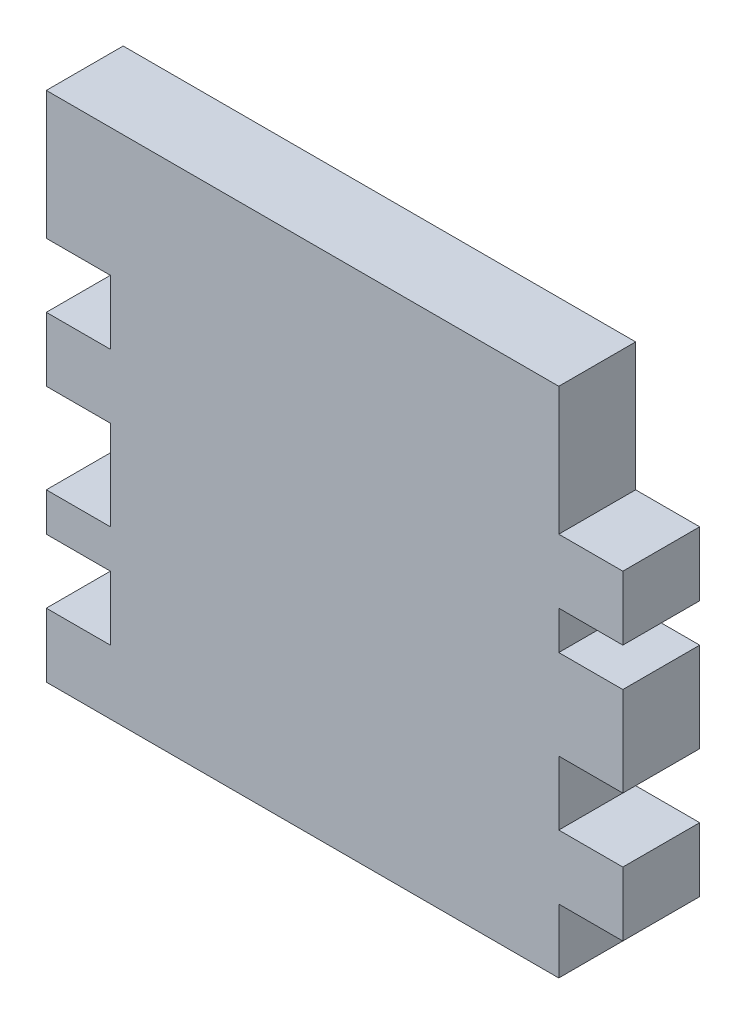
ISO-10303-21;
HEADER;
FILE_DESCRIPTION(('STEP AP214'),'2;1');
FILE_NAME('part.step','',(''),(''),'','','');
FILE_SCHEMA(('AUTOMOTIVE_DESIGN { 1 0 10303 214 1 1 1 1 }'));
ENDSEC;
DATA;
#1=APPLICATION_CONTEXT('core data for automotive mechanical design processes');
#2=APPLICATION_PROTOCOL_DEFINITION('international standard','automotive_design',2000,#1);
#3=PRODUCT_CONTEXT('',#1,'mechanical');
#4=PRODUCT('Part','Part','',(#3));
#5=PRODUCT_RELATED_PRODUCT_CATEGORY('part','',(#4));
#6=PRODUCT_DEFINITION_FORMATION('','',#4);
#7=PRODUCT_DEFINITION_CONTEXT('part definition',#1,'design');
#8=PRODUCT_DEFINITION('design','',#6,#7);
#9=PRODUCT_DEFINITION_SHAPE('','',#8);
#10=(LENGTH_UNIT() NAMED_UNIT(*) SI_UNIT(.MILLI.,.METRE.));
#11=(NAMED_UNIT(*) PLANE_ANGLE_UNIT() SI_UNIT($,.RADIAN.));
#12=(NAMED_UNIT(*) SI_UNIT($,.STERADIAN.) SOLID_ANGLE_UNIT());
#13=UNCERTAINTY_MEASURE_WITH_UNIT(LENGTH_MEASURE(1.E-05),#10,'distance_accuracy_value','');
#14=(GEOMETRIC_REPRESENTATION_CONTEXT(3) GLOBAL_UNCERTAINTY_ASSIGNED_CONTEXT((#13)) GLOBAL_UNIT_ASSIGNED_CONTEXT((#10,
#11,#12)) REPRESENTATION_CONTEXT('',''));
#15=CARTESIAN_POINT('',(0.,0.,0.));
#16=DIRECTION('',(0.,0.,1.));
#17=DIRECTION('',(1.,0.,0.));
#18=AXIS2_PLACEMENT_3D('',#15,#16,#17);
#19=CARTESIAN_POINT('',(0.,0.,6.));
#20=DIRECTION('',(0.,0.,-1.));
#21=DIRECTION('',(-1.,0.,0.));
#22=AXIS2_PLACEMENT_3D('',#19,#20,#21);
#23=PLANE('',#22);
#24=DIRECTION('',(0.,1.,0.));
#25=VECTOR('',#24,1.);
#26=CARTESIAN_POINT('',(21.566265060241,0.,6.));
#27=LINE('',#26,#25);
#28=CARTESIAN_POINT('',(21.566265060241,7.48493975903614,6.));
#29=VERTEX_POINT('',#28);
#30=CARTESIAN_POINT('',(21.566265060241,17.4849397590361,6.));
#31=VERTEX_POINT('',#30);
#32=EDGE_CURVE('E232',#29,#31,#27,.T.);
#33=ORIENTED_EDGE('',*,*,#32,.T.);
#34=DIRECTION('',(1.,0.,0.));
#35=VECTOR('',#34,1.);
#36=CARTESIAN_POINT('',(-18.433734939759,17.4849397590361,6.));
#37=LINE('',#36,#35);
#38=CARTESIAN_POINT('',(-18.433734939759,17.4849397590361,6.));
#39=VERTEX_POINT('',#38);
#40=EDGE_CURVE('E475',#39,#31,#37,.T.);
#41=ORIENTED_EDGE('',*,*,#40,.F.);
#42=DIRECTION('',(0.,-1.,0.));
#43=VECTOR('',#42,1.);
#44=CARTESIAN_POINT('',(-18.433734939759,17.4849397590361,6.));
#45=LINE('',#44,#43);
#46=CARTESIAN_POINT('',(-18.433734939759,7.48493975903614,6.));
#47=VERTEX_POINT('',#46);
#48=EDGE_CURVE('E480',#39,#47,#45,.T.);
#49=ORIENTED_EDGE('',*,*,#48,.T.);
#50=DIRECTION('',(1.,0.,0.));
#51=VECTOR('',#50,1.);
#52=CARTESIAN_POINT('',(-18.433734939759,7.48493975903614,6.));
#53=LINE('',#52,#51);
#54=CARTESIAN_POINT('',(-13.433734939759,7.48493975903614,6.));
#55=VERTEX_POINT('',#54);
#56=EDGE_CURVE('E361',#47,#55,#53,.T.);
#57=ORIENTED_EDGE('',*,*,#56,.T.);
#58=DIRECTION('',(0.,-1.,0.));
#59=VECTOR('',#58,1.);
#60=CARTESIAN_POINT('',(-13.433734939759,7.48493975903614,6.));
#61=LINE('',#60,#59);
#62=CARTESIAN_POINT('',(-13.433734939759,2.48493975903614,6.));
#63=VERTEX_POINT('',#62);
#64=EDGE_CURVE('E373',#55,#63,#61,.T.);
#65=ORIENTED_EDGE('',*,*,#64,.T.);
#66=DIRECTION('',(1.,0.,0.));
#67=VECTOR('',#66,1.);
#68=CARTESIAN_POINT('',(-18.433734939759,2.48493975903614,6.));
#69=LINE('',#68,#67);
#70=CARTESIAN_POINT('',(-18.433734939759,2.48493975903614,6.));
#71=VERTEX_POINT('',#70);
#72=EDGE_CURVE('E369',#71,#63,#69,.T.);
#73=ORIENTED_EDGE('',*,*,#72,.F.);
#74=CARTESIAN_POINT('',(-18.433734939759,-2.51506024096386,6.));
#75=VERTEX_POINT('',#74);
#76=EDGE_CURVE('E484',#71,#75,#45,.T.);
#77=ORIENTED_EDGE('',*,*,#76,.T.);
#78=DIRECTION('',(1.,0.,0.));
#79=VECTOR('',#78,1.);
#80=CARTESIAN_POINT('',(-18.433734939759,-2.51506024096386,6.));
#81=LINE('',#80,#79);
#82=CARTESIAN_POINT('',(-13.433734939759,-2.51506024096386,6.));
#83=VERTEX_POINT('',#82);
#84=EDGE_CURVE('E409',#75,#83,#81,.T.);
#85=ORIENTED_EDGE('',*,*,#84,.T.);
#86=DIRECTION('',(0.,-1.,0.));
#87=VECTOR('',#86,1.);
#88=CARTESIAN_POINT('',(-13.433734939759,-2.51506024096386,6.));
#89=LINE('',#88,#87);
#90=CARTESIAN_POINT('',(-13.433734939759,-9.51506024096386,6.));
#91=VERTEX_POINT('',#90);
#92=EDGE_CURVE('E413',#83,#91,#89,.T.);
#93=ORIENTED_EDGE('',*,*,#92,.T.);
#94=DIRECTION('',(1.,0.,0.));
#95=VECTOR('',#94,1.);
#96=CARTESIAN_POINT('',(-18.433734939759,-9.51506024096386,6.));
#97=LINE('',#96,#95);
#98=CARTESIAN_POINT('',(-18.433734939759,-9.51506024096386,6.));
#99=VERTEX_POINT('',#98);
#100=EDGE_CURVE('E374',#99,#91,#97,.T.);
#101=ORIENTED_EDGE('',*,*,#100,.F.);
#102=CARTESIAN_POINT('',(-18.433734939759,-12.5150602409639,6.));
#103=VERTEX_POINT('',#102);
#104=EDGE_CURVE('E518',#99,#103,#45,.T.);
#105=ORIENTED_EDGE('',*,*,#104,.T.);
#106=DIRECTION('',(1.,0.,0.));
#107=VECTOR('',#106,1.);
#108=CARTESIAN_POINT('',(-18.433734939759,-12.5150602409639,6.));
#109=LINE('',#108,#107);
#110=CARTESIAN_POINT('',(-13.433734939759,-12.5150602409639,6.));
#111=VERTEX_POINT('',#110);
#112=EDGE_CURVE('E443',#103,#111,#109,.T.);
#113=ORIENTED_EDGE('',*,*,#112,.T.);
#114=DIRECTION('',(0.,-1.,0.));
#115=VECTOR('',#114,1.);
#116=CARTESIAN_POINT('',(-13.433734939759,-12.5150602409639,6.));
#117=LINE('',#116,#115);
#118=CARTESIAN_POINT('',(-13.433734939759,-17.5150602409639,6.));
#119=VERTEX_POINT('',#118);
#120=EDGE_CURVE('E447',#111,#119,#117,.T.);
#121=ORIENTED_EDGE('',*,*,#120,.T.);
#122=DIRECTION('',(1.,0.,0.));
#123=VECTOR('',#122,1.);
#124=CARTESIAN_POINT('',(-18.433734939759,-17.5150602409639,6.));
#125=LINE('',#124,#123);
#126=CARTESIAN_POINT('',(-18.433734939759,-17.5150602409639,6.));
#127=VERTEX_POINT('',#126);
#128=EDGE_CURVE('E408',#127,#119,#125,.T.);
#129=ORIENTED_EDGE('',*,*,#128,.F.);
#130=CARTESIAN_POINT('',(-18.433734939759,-22.5150602409639,6.));
#131=VERTEX_POINT('',#130);
#132=EDGE_CURVE('E479',#127,#131,#45,.T.);
#133=ORIENTED_EDGE('',*,*,#132,.T.);
#134=DIRECTION('',(1.,0.,0.));
#135=VECTOR('',#134,1.);
#136=CARTESIAN_POINT('',(-18.433734939759,-22.5150602409639,6.));
#137=LINE('',#136,#135);
#138=CARTESIAN_POINT('',(21.566265060241,-22.5150602409639,6.));
#139=VERTEX_POINT('',#138);
#140=EDGE_CURVE('E464',#131,#139,#137,.T.);
#141=ORIENTED_EDGE('',*,*,#140,.T.);
#142=DIRECTION('',(0.,-1.,0.));
#143=VECTOR('',#142,1.);
#144=CARTESIAN_POINT('',(21.566265060241,0.,6.));
#145=LINE('',#144,#143);
#146=CARTESIAN_POINT('',(21.566265060241,-17.5150602409639,6.));
#147=VERTEX_POINT('',#146);
#148=EDGE_CURVE('E337',#147,#139,#145,.T.);
#149=ORIENTED_EDGE('',*,*,#148,.F.);
#150=DIRECTION('',(-1.,0.,0.));
#151=VECTOR('',#150,1.);
#152=CARTESIAN_POINT('',(0.,-17.5150602409638,6.));
#153=LINE('',#152,#151);
#154=CARTESIAN_POINT('',(26.566265060241,-17.5150602409639,6.));
#155=VERTEX_POINT('',#154);
#156=EDGE_CURVE('E342',#155,#147,#153,.T.);
#157=ORIENTED_EDGE('',*,*,#156,.F.);
#158=DIRECTION('',(0.,-1.,0.));
#159=VECTOR('',#158,1.);
#160=CARTESIAN_POINT('',(26.566265060241,17.4849397590361,6.));
#161=LINE('',#160,#159);
#162=CARTESIAN_POINT('',(26.566265060241,-12.5150602409639,6.));
#163=VERTEX_POINT('',#162);
#164=EDGE_CURVE('E468',#163,#155,#161,.T.);
#165=ORIENTED_EDGE('',*,*,#164,.F.);
#166=DIRECTION('',(-1.,0.,0.));
#167=VECTOR('',#166,1.);
#168=CARTESIAN_POINT('',(0.,-12.5150602409639,6.));
#169=LINE('',#168,#167);
#170=CARTESIAN_POINT('',(21.566265060241,-12.5150602409639,6.));
#171=VERTEX_POINT('',#170);
#172=EDGE_CURVE('E65',#163,#171,#169,.T.);
#173=ORIENTED_EDGE('',*,*,#172,.T.);
#174=DIRECTION('',(0.,1.,0.));
#175=VECTOR('',#174,1.);
#176=CARTESIAN_POINT('',(21.566265060241,0.,6.));
#177=LINE('',#176,#175);
#178=CARTESIAN_POINT('',(21.566265060241,-7.51506024096386,6.));
#179=VERTEX_POINT('',#178);
#180=EDGE_CURVE('E314',#171,#179,#177,.T.);
#181=ORIENTED_EDGE('',*,*,#180,.T.);
#182=DIRECTION('',(-1.,0.,0.));
#183=VECTOR('',#182,1.);
#184=CARTESIAN_POINT('',(0.,-7.51506024096386,6.));
#185=LINE('',#184,#183);
#186=CARTESIAN_POINT('',(26.566265060241,-7.51506024096386,6.));
#187=VERTEX_POINT('',#186);
#188=EDGE_CURVE('E306',#187,#179,#185,.T.);
#189=ORIENTED_EDGE('',*,*,#188,.F.);
#190=CARTESIAN_POINT('',(26.566265060241,-0.515060240963858,6.));
#191=VERTEX_POINT('',#190);
#192=EDGE_CURVE('E473',#191,#187,#161,.T.);
#193=ORIENTED_EDGE('',*,*,#192,.F.);
#194=DIRECTION('',(-1.,0.,0.));
#195=VECTOR('',#194,1.);
#196=CARTESIAN_POINT('',(0.,-0.51506024096386,6.));
#197=LINE('',#196,#195);
#198=CARTESIAN_POINT('',(21.566265060241,-0.515060240963858,6.));
#199=VERTEX_POINT('',#198);
#200=EDGE_CURVE('E282',#191,#199,#197,.T.);
#201=ORIENTED_EDGE('',*,*,#200,.T.);
#202=DIRECTION('',(0.,1.,0.));
#203=VECTOR('',#202,1.);
#204=CARTESIAN_POINT('',(21.566265060241,0.,6.));
#205=LINE('',#204,#203);
#206=CARTESIAN_POINT('',(21.566265060241,2.48493975903614,6.));
#207=VERTEX_POINT('',#206);
#208=EDGE_CURVE('E278',#199,#207,#205,.T.);
#209=ORIENTED_EDGE('',*,*,#208,.T.);
#210=DIRECTION('',(1.,0.,0.));
#211=VECTOR('',#210,1.);
#212=CARTESIAN_POINT('',(0.,2.48493975903614,6.));
#213=LINE('',#212,#211);
#214=CARTESIAN_POINT('',(26.566265060241,2.48493975903614,6.));
#215=VERTEX_POINT('',#214);
#216=EDGE_CURVE('E271',#207,#215,#213,.T.);
#217=ORIENTED_EDGE('',*,*,#216,.T.);
#218=CARTESIAN_POINT('',(26.566265060241,7.48493975903614,6.));
#219=VERTEX_POINT('',#218);
#220=EDGE_CURVE('E474',#219,#215,#161,.T.);
#221=ORIENTED_EDGE('',*,*,#220,.F.);
#222=DIRECTION('',(1.,0.,0.));
#223=VECTOR('',#222,1.);
#224=CARTESIAN_POINT('',(0.,7.48493975903614,6.));
#225=LINE('',#224,#223);
#226=EDGE_CURVE('E253',#29,#219,#225,.T.);
#227=ORIENTED_EDGE('',*,*,#226,.F.);
#228=EDGE_LOOP('',(#33,#41,#49,#57,#65,#73,#77,#85,#93,#101,#105,#113,#121,#129,#133,#141,#149,
#157,#165,#173,#181,#189,#193,#201,#209,#217,#221,#227));
#229=FACE_BOUND('',#228,.T.);
#230=ADVANCED_FACE('F41',(#229),#23,.F.);
#231=CARTESIAN_POINT('',(0.,0.,0.));
#232=DIRECTION('',(0.,0.,-1.));
#233=DIRECTION('',(-1.,0.,0.));
#234=AXIS2_PLACEMENT_3D('',#231,#232,#233);
#235=PLANE('',#234);
#236=DIRECTION('',(1.,0.,0.));
#237=VECTOR('',#236,1.);
#238=CARTESIAN_POINT('',(-18.433734939759,17.4849397590361,0.));
#239=LINE('',#238,#237);
#240=CARTESIAN_POINT('',(-18.433734939759,17.4849397590361,0.));
#241=VERTEX_POINT('',#240);
#242=CARTESIAN_POINT('',(21.5662650602409,17.4849397590361,0.));
#243=VERTEX_POINT('',#242);
#244=EDGE_CURVE('E251',#241,#243,#239,.T.);
#245=ORIENTED_EDGE('',*,*,#244,.T.);
#246=DIRECTION('',(0.,1.,0.));
#247=VECTOR('',#246,1.);
#248=CARTESIAN_POINT('',(21.566265060241,0.,0.));
#249=LINE('',#248,#247);
#250=CARTESIAN_POINT('',(21.566265060241,7.48493975903614,0.));
#251=VERTEX_POINT('',#250);
#252=EDGE_CURVE('E229',#251,#243,#249,.T.);
#253=ORIENTED_EDGE('',*,*,#252,.F.);
#254=DIRECTION('',(1.,0.,0.));
#255=VECTOR('',#254,1.);
#256=CARTESIAN_POINT('',(0.,7.48493975903614,0.));
#257=LINE('',#256,#255);
#258=CARTESIAN_POINT('',(26.566265060241,7.48493975903614,0.));
#259=VERTEX_POINT('',#258);
#260=EDGE_CURVE('E237',#251,#259,#257,.T.);
#261=ORIENTED_EDGE('',*,*,#260,.T.);
#262=DIRECTION('',(0.,-1.,0.));
#263=VECTOR('',#262,1.);
#264=CARTESIAN_POINT('',(26.566265060241,17.4849397590361,0.));
#265=LINE('',#264,#263);
#266=CARTESIAN_POINT('',(26.566265060241,2.48493975903614,0.));
#267=VERTEX_POINT('',#266);
#268=EDGE_CURVE('E493',#259,#267,#265,.T.);
#269=ORIENTED_EDGE('',*,*,#268,.T.);
#270=DIRECTION('',(1.,0.,0.));
#271=VECTOR('',#270,1.);
#272=CARTESIAN_POINT('',(0.,2.48493975903614,0.));
#273=LINE('',#272,#271);
#274=CARTESIAN_POINT('',(21.566265060241,2.48493975903614,0.));
#275=VERTEX_POINT('',#274);
#276=EDGE_CURVE('E274',#275,#267,#273,.T.);
#277=ORIENTED_EDGE('',*,*,#276,.F.);
#278=DIRECTION('',(0.,1.,0.));
#279=VECTOR('',#278,1.);
#280=CARTESIAN_POINT('',(21.566265060241,0.,0.));
#281=LINE('',#280,#279);
#282=CARTESIAN_POINT('',(21.566265060241,-0.515060240963858,0.));
#283=VERTEX_POINT('',#282);
#284=EDGE_CURVE('E267',#283,#275,#281,.T.);
#285=ORIENTED_EDGE('',*,*,#284,.F.);
#286=DIRECTION('',(-1.,0.,0.));
#287=VECTOR('',#286,1.);
#288=CARTESIAN_POINT('',(0.,-0.51506024096386,0.));
#289=LINE('',#288,#287);
#290=CARTESIAN_POINT('',(26.566265060241,-0.515060240963858,0.));
#291=VERTEX_POINT('',#290);
#292=EDGE_CURVE('E270',#291,#283,#289,.T.);
#293=ORIENTED_EDGE('',*,*,#292,.F.);
#294=CARTESIAN_POINT('',(26.566265060241,-7.51506024096386,0.));
#295=VERTEX_POINT('',#294);
#296=EDGE_CURVE('E492',#291,#295,#265,.T.);
#297=ORIENTED_EDGE('',*,*,#296,.T.);
#298=DIRECTION('',(-1.,0.,0.));
#299=VECTOR('',#298,1.);
#300=CARTESIAN_POINT('',(0.,-7.51506024096386,0.));
#301=LINE('',#300,#299);
#302=CARTESIAN_POINT('',(21.566265060241,-7.51506024096386,0.));
#303=VERTEX_POINT('',#302);
#304=EDGE_CURVE('E309',#295,#303,#301,.T.);
#305=ORIENTED_EDGE('',*,*,#304,.T.);
#306=DIRECTION('',(0.,1.,0.));
#307=VECTOR('',#306,1.);
#308=CARTESIAN_POINT('',(21.566265060241,0.,0.));
#309=LINE('',#308,#307);
#310=CARTESIAN_POINT('',(21.566265060241,-12.5150602409639,0.));
#311=VERTEX_POINT('',#310);
#312=EDGE_CURVE('E302',#311,#303,#309,.T.);
#313=ORIENTED_EDGE('',*,*,#312,.F.);
#314=DIRECTION('',(-1.,0.,0.));
#315=VECTOR('',#314,1.);
#316=CARTESIAN_POINT('',(0.,-12.5150602409639,0.));
#317=LINE('',#316,#315);
#318=CARTESIAN_POINT('',(26.566265060241,-12.5150602409639,0.));
#319=VERTEX_POINT('',#318);
#320=EDGE_CURVE('E305',#319,#311,#317,.T.);
#321=ORIENTED_EDGE('',*,*,#320,.F.);
#322=CARTESIAN_POINT('',(26.566265060241,-17.5150602409639,0.));
#323=VERTEX_POINT('',#322);
#324=EDGE_CURVE('E488',#319,#323,#265,.T.);
#325=ORIENTED_EDGE('',*,*,#324,.T.);
#326=DIRECTION('',(-1.,0.,0.));
#327=VECTOR('',#326,1.);
#328=CARTESIAN_POINT('',(0.,-17.5150602409638,0.));
#329=LINE('',#328,#327);
#330=CARTESIAN_POINT('',(21.566265060241,-17.5150602409639,0.));
#331=VERTEX_POINT('',#330);
#332=EDGE_CURVE('E57',#323,#331,#329,.T.);
#333=ORIENTED_EDGE('',*,*,#332,.T.);
#334=DIRECTION('',(0.,-1.,0.));
#335=VECTOR('',#334,1.);
#336=CARTESIAN_POINT('',(21.566265060241,0.,0.));
#337=LINE('',#336,#335);
#338=CARTESIAN_POINT('',(21.566265060241,-22.5150602409639,0.));
#339=VERTEX_POINT('',#338);
#340=EDGE_CURVE('E336',#331,#339,#337,.T.);
#341=ORIENTED_EDGE('',*,*,#340,.T.);
#342=DIRECTION('',(1.,0.,0.));
#343=VECTOR('',#342,1.);
#344=CARTESIAN_POINT('',(-18.433734939759,-22.5150602409639,0.));
#345=LINE('',#344,#343);
#346=CARTESIAN_POINT('',(-18.433734939759,-22.5150602409639,0.));
#347=VERTEX_POINT('',#346);
#348=EDGE_CURVE('E384',#347,#339,#345,.T.);
#349=ORIENTED_EDGE('',*,*,#348,.F.);
#350=DIRECTION('',(0.,-1.,0.));
#351=VECTOR('',#350,1.);
#352=CARTESIAN_POINT('',(-18.433734939759,17.4849397590361,0.));
#353=LINE('',#352,#351);
#354=CARTESIAN_POINT('',(-18.433734939759,-17.5150602409639,0.));
#355=VERTEX_POINT('',#354);
#356=EDGE_CURVE('E496',#355,#347,#353,.T.);
#357=ORIENTED_EDGE('',*,*,#356,.F.);
#358=DIRECTION('',(1.,0.,0.));
#359=VECTOR('',#358,1.);
#360=CARTESIAN_POINT('',(-18.433734939759,-17.5150602409639,0.));
#361=LINE('',#360,#359);
#362=CARTESIAN_POINT('',(-13.433734939759,-17.5150602409639,0.));
#363=VERTEX_POINT('',#362);
#364=EDGE_CURVE('E448',#355,#363,#361,.T.);
#365=ORIENTED_EDGE('',*,*,#364,.T.);
#366=DIRECTION('',(0.,-1.,0.));
#367=VECTOR('',#366,1.);
#368=CARTESIAN_POINT('',(-13.433734939759,-12.5150602409639,0.));
#369=LINE('',#368,#367);
#370=CARTESIAN_POINT('',(-13.433734939759,-12.5150602409639,0.));
#371=VERTEX_POINT('',#370);
#372=EDGE_CURVE('E458',#371,#363,#369,.T.);
#373=ORIENTED_EDGE('',*,*,#372,.F.);
#374=DIRECTION('',(1.,0.,0.));
#375=VECTOR('',#374,1.);
#376=CARTESIAN_POINT('',(-18.433734939759,-12.5150602409639,0.));
#377=LINE('',#376,#375);
#378=CARTESIAN_POINT('',(-18.433734939759,-12.5150602409639,0.));
#379=VERTEX_POINT('',#378);
#380=EDGE_CURVE('E433',#379,#371,#377,.T.);
#381=ORIENTED_EDGE('',*,*,#380,.F.);
#382=CARTESIAN_POINT('',(-18.433734939759,-9.51506024096386,0.));
#383=VERTEX_POINT('',#382);
#384=EDGE_CURVE('E547',#383,#379,#353,.T.);
#385=ORIENTED_EDGE('',*,*,#384,.F.);
#386=DIRECTION('',(1.,0.,0.));
#387=VECTOR('',#386,1.);
#388=CARTESIAN_POINT('',(-18.433734939759,-9.51506024096386,0.));
#389=LINE('',#388,#387);
#390=CARTESIAN_POINT('',(-13.433734939759,-9.51506024096386,0.));
#391=VERTEX_POINT('',#390);
#392=EDGE_CURVE('E414',#383,#391,#389,.T.);
#393=ORIENTED_EDGE('',*,*,#392,.T.);
#394=DIRECTION('',(0.,-1.,0.));
#395=VECTOR('',#394,1.);
#396=CARTESIAN_POINT('',(-13.433734939759,-2.51506024096386,0.));
#397=LINE('',#396,#395);
#398=CARTESIAN_POINT('',(-13.433734939759,-2.51506024096386,0.));
#399=VERTEX_POINT('',#398);
#400=EDGE_CURVE('E424',#399,#391,#397,.T.);
#401=ORIENTED_EDGE('',*,*,#400,.F.);
#402=DIRECTION('',(1.,0.,0.));
#403=VECTOR('',#402,1.);
#404=CARTESIAN_POINT('',(-18.433734939759,-2.51506024096386,0.));
#405=LINE('',#404,#403);
#406=CARTESIAN_POINT('',(-18.433734939759,-2.51506024096386,0.));
#407=VERTEX_POINT('',#406);
#408=EDGE_CURVE('E397',#407,#399,#405,.T.);
#409=ORIENTED_EDGE('',*,*,#408,.F.);
#410=CARTESIAN_POINT('',(-18.433734939759,2.48493975903614,0.));
#411=VERTEX_POINT('',#410);
#412=EDGE_CURVE('E499',#411,#407,#353,.T.);
#413=ORIENTED_EDGE('',*,*,#412,.F.);
#414=DIRECTION('',(1.,0.,0.));
#415=VECTOR('',#414,1.);
#416=CARTESIAN_POINT('',(-18.433734939759,2.48493975903614,0.));
#417=LINE('',#416,#415);
#418=CARTESIAN_POINT('',(-13.433734939759,2.48493975903614,0.));
#419=VERTEX_POINT('',#418);
#420=EDGE_CURVE('E356',#411,#419,#417,.T.);
#421=ORIENTED_EDGE('',*,*,#420,.T.);
#422=DIRECTION('',(0.,-1.,0.));
#423=VECTOR('',#422,1.);
#424=CARTESIAN_POINT('',(-13.433734939759,7.48493975903614,0.));
#425=LINE('',#424,#423);
#426=CARTESIAN_POINT('',(-13.433734939759,7.48493975903614,0.));
#427=VERTEX_POINT('',#426);
#428=EDGE_CURVE('E360',#427,#419,#425,.T.);
#429=ORIENTED_EDGE('',*,*,#428,.F.);
#430=DIRECTION('',(1.,0.,0.));
#431=VECTOR('',#430,1.);
#432=CARTESIAN_POINT('',(-18.433734939759,7.48493975903614,0.));
#433=LINE('',#432,#431);
#434=CARTESIAN_POINT('',(-18.433734939759,7.48493975903614,0.));
#435=VERTEX_POINT('',#434);
#436=EDGE_CURVE('E364',#435,#427,#433,.T.);
#437=ORIENTED_EDGE('',*,*,#436,.F.);
#438=EDGE_CURVE('E469',#241,#435,#353,.T.);
#439=ORIENTED_EDGE('',*,*,#438,.F.);
#440=EDGE_LOOP('',(#245,#253,#261,#269,#277,#285,#293,#297,#305,#313,#321,#325,#333,#341,#349,
#357,#365,#373,#381,#385,#393,#401,#409,#413,#421,#429,#437,#439));
#441=FACE_BOUND('',#440,.T.);
#442=ADVANCED_FACE('F248',(#441),#235,.T.);
#443=CARTESIAN_POINT('',(26.566265060241,17.4849397590361,6.));
#444=DIRECTION('',(1.,0.,0.));
#445=DIRECTION('',(0.,1.,0.));
#446=AXIS2_PLACEMENT_3D('',#443,#444,#445);
#447=PLANE('',#446);
#448=DIRECTION('',(0.,0.,1.));
#449=VECTOR('',#448,1.);
#450=CARTESIAN_POINT('',(26.566265060241,7.48493975903614,0.));
#451=LINE('',#450,#449);
#452=EDGE_CURVE('E236',#259,#219,#451,.T.);
#453=ORIENTED_EDGE('',*,*,#452,.T.);
#454=ORIENTED_EDGE('',*,*,#220,.T.);
#455=DIRECTION('',(0.,0.,1.));
#456=VECTOR('',#455,1.);
#457=CARTESIAN_POINT('',(26.566265060241,2.48493975903614,0.));
#458=LINE('',#457,#456);
#459=EDGE_CURVE('E293',#267,#215,#458,.T.);
#460=ORIENTED_EDGE('',*,*,#459,.F.);
#461=ORIENTED_EDGE('',*,*,#268,.F.);
#462=EDGE_LOOP('',(#453,#454,#460,#461));
#463=FACE_BOUND('',#462,.T.);
#464=ADVANCED_FACE('F569',(#463),#447,.T.);
#465=ORIENTED_EDGE('',*,*,#296,.F.);
#466=DIRECTION('',(0.,0.,1.));
#467=VECTOR('',#466,1.);
#468=CARTESIAN_POINT('',(26.566265060241,-0.515060240963858,0.));
#469=LINE('',#468,#467);
#470=EDGE_CURVE('E296',#291,#191,#469,.T.);
#471=ORIENTED_EDGE('',*,*,#470,.T.);
#472=ORIENTED_EDGE('',*,*,#192,.T.);
#473=DIRECTION('',(0.,0.,1.));
#474=VECTOR('',#473,1.);
#475=CARTESIAN_POINT('',(26.566265060241,-7.51506024096386,0.));
#476=LINE('',#475,#474);
#477=EDGE_CURVE('E326',#295,#187,#476,.T.);
#478=ORIENTED_EDGE('',*,*,#477,.F.);
#479=EDGE_LOOP('',(#465,#471,#472,#478));
#480=FACE_BOUND('',#479,.T.);
#481=ADVANCED_FACE('F587',(#480),#447,.T.);
#482=ORIENTED_EDGE('',*,*,#324,.F.);
#483=DIRECTION('',(0.,0.,1.));
#484=VECTOR('',#483,1.);
#485=CARTESIAN_POINT('',(26.566265060241,-12.5150602409639,0.));
#486=LINE('',#485,#484);
#487=EDGE_CURVE('E329',#319,#163,#486,.T.);
#488=ORIENTED_EDGE('',*,*,#487,.T.);
#489=ORIENTED_EDGE('',*,*,#164,.T.);
#490=DIRECTION('',(0.,0.,1.));
#491=VECTOR('',#490,1.);
#492=CARTESIAN_POINT('',(26.566265060241,-17.5150602409639,0.));
#493=LINE('',#492,#491);
#494=EDGE_CURVE('E318',#323,#155,#493,.T.);
#495=ORIENTED_EDGE('',*,*,#494,.F.);
#496=EDGE_LOOP('',(#482,#488,#489,#495));
#497=FACE_BOUND('',#496,.T.);
#498=ADVANCED_FACE('F601',(#497),#447,.T.);
#499=CARTESIAN_POINT('',(-18.433734939759,17.4849397590361,6.));
#500=DIRECTION('',(0.,1.,0.));
#501=DIRECTION('',(0.,0.,1.));
#502=AXIS2_PLACEMENT_3D('',#499,#500,#501);
#503=PLANE('',#502);
#504=ORIENTED_EDGE('',*,*,#40,.T.);
#505=DIRECTION('',(0.,0.,1.));
#506=VECTOR('',#505,1.);
#507=CARTESIAN_POINT('',(21.566265060241,17.4849397590361,0.));
#508=LINE('',#507,#506);
#509=EDGE_CURVE('E261',#243,#31,#508,.T.);
#510=ORIENTED_EDGE('',*,*,#509,.F.);
#511=ORIENTED_EDGE('',*,*,#244,.F.);
#512=DIRECTION('',(0.,0.,-1.));
#513=VECTOR('',#512,1.);
#514=CARTESIAN_POINT('',(-18.433734939759,17.4849397590361,6.));
#515=LINE('',#514,#513);
#516=EDGE_CURVE('E11',#39,#241,#515,.T.);
#517=ORIENTED_EDGE('',*,*,#516,.F.);
#518=EDGE_LOOP('',(#504,#510,#511,#517));
#519=FACE_BOUND('',#518,.T.);
#520=ADVANCED_FACE('F624',(#519),#503,.T.);
#521=CARTESIAN_POINT('',(-18.433734939759,17.4849397590361,6.));
#522=DIRECTION('',(1.,0.,0.));
#523=DIRECTION('',(0.,0.,-1.));
#524=AXIS2_PLACEMENT_3D('',#521,#522,#523);
#525=PLANE('',#524);
#526=DIRECTION('',(0.,0.,1.));
#527=VECTOR('',#526,1.);
#528=CARTESIAN_POINT('',(-18.433734939759,7.48493975903614,0.));
#529=LINE('',#528,#527);
#530=EDGE_CURVE('E385',#435,#47,#529,.T.);
#531=ORIENTED_EDGE('',*,*,#530,.T.);
#532=ORIENTED_EDGE('',*,*,#48,.F.);
#533=ORIENTED_EDGE('',*,*,#516,.T.);
#534=ORIENTED_EDGE('',*,*,#438,.T.);
#535=EDGE_LOOP('',(#531,#532,#533,#534));
#536=FACE_BOUND('',#535,.T.);
#537=ADVANCED_FACE('F623',(#536),#525,.F.);
#538=ORIENTED_EDGE('',*,*,#76,.F.);
#539=DIRECTION('',(0.,0.,1.));
#540=VECTOR('',#539,1.);
#541=CARTESIAN_POINT('',(-18.433734939759,2.48493975903614,0.));
#542=LINE('',#541,#540);
#543=EDGE_CURVE('E381',#411,#71,#542,.T.);
#544=ORIENTED_EDGE('',*,*,#543,.F.);
#545=ORIENTED_EDGE('',*,*,#412,.T.);
#546=DIRECTION('',(0.,0.,1.));
#547=VECTOR('',#546,1.);
#548=CARTESIAN_POINT('',(-18.433734939759,-2.51506024096386,0.));
#549=LINE('',#548,#547);
#550=EDGE_CURVE('E401',#407,#75,#549,.T.);
#551=ORIENTED_EDGE('',*,*,#550,.T.);
#552=EDGE_LOOP('',(#538,#544,#545,#551));
#553=FACE_BOUND('',#552,.T.);
#554=ADVANCED_FACE('F529',(#553),#525,.F.);
#555=ORIENTED_EDGE('',*,*,#104,.F.);
#556=DIRECTION('',(0.,0.,1.));
#557=VECTOR('',#556,1.);
#558=CARTESIAN_POINT('',(-18.433734939759,-9.51506024096386,0.));
#559=LINE('',#558,#557);
#560=EDGE_CURVE('E405',#383,#99,#559,.T.);
#561=ORIENTED_EDGE('',*,*,#560,.F.);
#562=ORIENTED_EDGE('',*,*,#384,.T.);
#563=DIRECTION('',(0.,0.,1.));
#564=VECTOR('',#563,1.);
#565=CARTESIAN_POINT('',(-18.433734939759,-12.5150602409639,0.));
#566=LINE('',#565,#564);
#567=EDGE_CURVE('E437',#379,#103,#566,.T.);
#568=ORIENTED_EDGE('',*,*,#567,.T.);
#569=EDGE_LOOP('',(#555,#561,#562,#568));
#570=FACE_BOUND('',#569,.T.);
#571=ADVANCED_FACE('F545',(#570),#525,.F.);
#572=CARTESIAN_POINT('',(-18.433734939759,-22.5150602409639,6.));
#573=DIRECTION('',(0.,1.,0.));
#574=DIRECTION('',(0.,0.,1.));
#575=AXIS2_PLACEMENT_3D('',#572,#573,#574);
#576=PLANE('',#575);
#577=ORIENTED_EDGE('',*,*,#348,.T.);
#578=DIRECTION('',(0.,0.,1.));
#579=VECTOR('',#578,1.);
#580=CARTESIAN_POINT('',(21.566265060241,-22.5150602409639,0.));
#581=LINE('',#580,#579);
#582=EDGE_CURVE('E350',#339,#139,#581,.T.);
#583=ORIENTED_EDGE('',*,*,#582,.T.);
#584=ORIENTED_EDGE('',*,*,#140,.F.);
#585=DIRECTION('',(0.,0.,-1.));
#586=VECTOR('',#585,1.);
#587=CARTESIAN_POINT('',(-18.433734939759,-22.5150602409639,6.));
#588=LINE('',#587,#586);
#589=EDGE_CURVE('E50',#131,#347,#588,.T.);
#590=ORIENTED_EDGE('',*,*,#589,.T.);
#591=EDGE_LOOP('',(#577,#583,#584,#590));
#592=FACE_BOUND('',#591,.T.);
#593=ADVANCED_FACE('F43',(#592),#576,.F.);
#594=ORIENTED_EDGE('',*,*,#132,.F.);
#595=DIRECTION('',(0.,0.,1.));
#596=VECTOR('',#595,1.);
#597=CARTESIAN_POINT('',(-18.433734939759,-17.5150602409639,0.));
#598=LINE('',#597,#596);
#599=EDGE_CURVE('E264',#355,#127,#598,.T.);
#600=ORIENTED_EDGE('',*,*,#599,.F.);
#601=ORIENTED_EDGE('',*,*,#356,.T.);
#602=ORIENTED_EDGE('',*,*,#589,.F.);
#603=EDGE_LOOP('',(#594,#600,#601,#602));
#604=FACE_BOUND('',#603,.T.);
#605=ADVANCED_FACE('F558',(#604),#525,.F.);
#606=CARTESIAN_POINT('',(-18.433734939759,-17.5150602409639,0.));
#607=DIRECTION('',(0.,-1.,0.));
#608=DIRECTION('',(1.,0.,0.));
#609=AXIS2_PLACEMENT_3D('',#606,#607,#608);
#610=PLANE('',#609);
#611=ORIENTED_EDGE('',*,*,#128,.T.);
#612=DIRECTION('',(0.,0.,1.));
#613=VECTOR('',#612,1.);
#614=CARTESIAN_POINT('',(-13.433734939759,-17.5150602409639,0.));
#615=LINE('',#614,#613);
#616=EDGE_CURVE('E430',#363,#119,#615,.T.);
#617=ORIENTED_EDGE('',*,*,#616,.F.);
#618=ORIENTED_EDGE('',*,*,#364,.F.);
#619=ORIENTED_EDGE('',*,*,#599,.T.);
#620=EDGE_LOOP('',(#611,#617,#618,#619));
#621=FACE_BOUND('',#620,.T.);
#622=ADVANCED_FACE('F557',(#621),#610,.F.);
#623=CARTESIAN_POINT('',(-18.433734939759,-12.5150602409639,0.));
#624=DIRECTION('',(0.,-1.,0.));
#625=DIRECTION('',(0.,0.,-1.));
#626=AXIS2_PLACEMENT_3D('',#623,#624,#625);
#627=PLANE('',#626);
#628=ORIENTED_EDGE('',*,*,#112,.F.);
#629=ORIENTED_EDGE('',*,*,#567,.F.);
#630=ORIENTED_EDGE('',*,*,#380,.T.);
#631=DIRECTION('',(0.,0.,1.));
#632=VECTOR('',#631,1.);
#633=CARTESIAN_POINT('',(-13.433734939759,-12.5150602409639,0.));
#634=LINE('',#633,#632);
#635=EDGE_CURVE('E434',#371,#111,#634,.T.);
#636=ORIENTED_EDGE('',*,*,#635,.T.);
#637=EDGE_LOOP('',(#628,#629,#630,#636));
#638=FACE_BOUND('',#637,.T.);
#639=ADVANCED_FACE('F550',(#638),#627,.T.);
#640=CARTESIAN_POINT('',(-13.433734939759,-12.5150602409639,0.));
#641=DIRECTION('',(-1.,0.,0.));
#642=DIRECTION('',(0.,0.,1.));
#643=AXIS2_PLACEMENT_3D('',#640,#641,#642);
#644=PLANE('',#643);
#645=ORIENTED_EDGE('',*,*,#120,.F.);
#646=ORIENTED_EDGE('',*,*,#635,.F.);
#647=ORIENTED_EDGE('',*,*,#372,.T.);
#648=ORIENTED_EDGE('',*,*,#616,.T.);
#649=EDGE_LOOP('',(#645,#646,#647,#648));
#650=FACE_BOUND('',#649,.T.);
#651=ADVANCED_FACE('F555',(#650),#644,.T.);
#652=CARTESIAN_POINT('',(-18.433734939759,-9.51506024096386,0.));
#653=DIRECTION('',(0.,-1.,0.));
#654=DIRECTION('',(0.,0.,-1.));
#655=AXIS2_PLACEMENT_3D('',#652,#653,#654);
#656=PLANE('',#655);
#657=ORIENTED_EDGE('',*,*,#100,.T.);
#658=DIRECTION('',(0.,0.,1.));
#659=VECTOR('',#658,1.);
#660=CARTESIAN_POINT('',(-13.433734939759,-9.51506024096386,0.));
#661=LINE('',#660,#659);
#662=EDGE_CURVE('E394',#391,#91,#661,.T.);
#663=ORIENTED_EDGE('',*,*,#662,.F.);
#664=ORIENTED_EDGE('',*,*,#392,.F.);
#665=ORIENTED_EDGE('',*,*,#560,.T.);
#666=EDGE_LOOP('',(#657,#663,#664,#665));
#667=FACE_BOUND('',#666,.T.);
#668=ADVANCED_FACE('F542',(#667),#656,.F.);
#669=CARTESIAN_POINT('',(-18.433734939759,-2.51506024096386,0.));
#670=DIRECTION('',(0.,-1.,0.));
#671=DIRECTION('',(0.,0.,-1.));
#672=AXIS2_PLACEMENT_3D('',#669,#670,#671);
#673=PLANE('',#672);
#674=ORIENTED_EDGE('',*,*,#84,.F.);
#675=ORIENTED_EDGE('',*,*,#550,.F.);
#676=ORIENTED_EDGE('',*,*,#408,.T.);
#677=DIRECTION('',(0.,0.,1.));
#678=VECTOR('',#677,1.);
#679=CARTESIAN_POINT('',(-13.433734939759,-2.51506024096386,0.));
#680=LINE('',#679,#678);
#681=EDGE_CURVE('E398',#399,#83,#680,.T.);
#682=ORIENTED_EDGE('',*,*,#681,.T.);
#683=EDGE_LOOP('',(#674,#675,#676,#682));
#684=FACE_BOUND('',#683,.T.);
#685=ADVANCED_FACE('F534',(#684),#673,.T.);
#686=CARTESIAN_POINT('',(-13.433734939759,-2.51506024096386,0.));
#687=DIRECTION('',(-1.,0.,0.));
#688=DIRECTION('',(0.,0.,1.));
#689=AXIS2_PLACEMENT_3D('',#686,#687,#688);
#690=PLANE('',#689);
#691=ORIENTED_EDGE('',*,*,#92,.F.);
#692=ORIENTED_EDGE('',*,*,#681,.F.);
#693=ORIENTED_EDGE('',*,*,#400,.T.);
#694=ORIENTED_EDGE('',*,*,#662,.T.);
#695=EDGE_LOOP('',(#691,#692,#693,#694));
#696=FACE_BOUND('',#695,.T.);
#697=ADVANCED_FACE('F540',(#696),#690,.T.);
#698=CARTESIAN_POINT('',(-18.433734939759,2.48493975903614,0.));
#699=DIRECTION('',(0.,-1.,0.));
#700=DIRECTION('',(0.,0.,-1.));
#701=AXIS2_PLACEMENT_3D('',#698,#699,#700);
#702=PLANE('',#701);
#703=ORIENTED_EDGE('',*,*,#72,.T.);
#704=DIRECTION('',(0.,0.,1.));
#705=VECTOR('',#704,1.);
#706=CARTESIAN_POINT('',(-13.433734939759,2.48493975903614,0.));
#707=LINE('',#706,#705);
#708=EDGE_CURVE('E368',#419,#63,#707,.T.);
#709=ORIENTED_EDGE('',*,*,#708,.F.);
#710=ORIENTED_EDGE('',*,*,#420,.F.);
#711=ORIENTED_EDGE('',*,*,#543,.T.);
#712=EDGE_LOOP('',(#703,#709,#710,#711));
#713=FACE_BOUND('',#712,.T.);
#714=ADVANCED_FACE('F700',(#713),#702,.F.);
#715=CARTESIAN_POINT('',(-18.433734939759,7.48493975903614,0.));
#716=DIRECTION('',(0.,-1.,0.));
#717=DIRECTION('',(0.,0.,-1.));
#718=AXIS2_PLACEMENT_3D('',#715,#716,#717);
#719=PLANE('',#718);
#720=ORIENTED_EDGE('',*,*,#56,.F.);
#721=ORIENTED_EDGE('',*,*,#530,.F.);
#722=ORIENTED_EDGE('',*,*,#436,.T.);
#723=DIRECTION('',(0.,0.,1.));
#724=VECTOR('',#723,1.);
#725=CARTESIAN_POINT('',(-13.433734939759,7.48493975903614,0.));
#726=LINE('',#725,#724);
#727=EDGE_CURVE('E389',#427,#55,#726,.T.);
#728=ORIENTED_EDGE('',*,*,#727,.T.);
#729=EDGE_LOOP('',(#720,#721,#722,#728));
#730=FACE_BOUND('',#729,.T.);
#731=ADVANCED_FACE('F707',(#730),#719,.T.);
#732=CARTESIAN_POINT('',(-13.433734939759,7.48493975903614,0.));
#733=DIRECTION('',(-1.,0.,0.));
#734=DIRECTION('',(0.,0.,1.));
#735=AXIS2_PLACEMENT_3D('',#732,#733,#734);
#736=PLANE('',#735);
#737=ORIENTED_EDGE('',*,*,#64,.F.);
#738=ORIENTED_EDGE('',*,*,#727,.F.);
#739=ORIENTED_EDGE('',*,*,#428,.T.);
#740=ORIENTED_EDGE('',*,*,#708,.T.);
#741=EDGE_LOOP('',(#737,#738,#739,#740));
#742=FACE_BOUND('',#741,.T.);
#743=ADVANCED_FACE('F715',(#742),#736,.T.);
#744=CARTESIAN_POINT('',(21.566265060241,0.,0.));
#745=DIRECTION('',(1.,0.,0.));
#746=DIRECTION('',(0.,0.,-1.));
#747=AXIS2_PLACEMENT_3D('',#744,#745,#746);
#748=PLANE('',#747);
#749=ORIENTED_EDGE('',*,*,#32,.F.);
#750=DIRECTION('',(0.,0.,1.));
#751=VECTOR('',#750,1.);
#752=CARTESIAN_POINT('',(21.566265060241,7.48493975903614,0.));
#753=LINE('',#752,#751);
#754=EDGE_CURVE('E225',#251,#29,#753,.T.);
#755=ORIENTED_EDGE('',*,*,#754,.F.);
#756=ORIENTED_EDGE('',*,*,#252,.T.);
#757=ORIENTED_EDGE('',*,*,#509,.T.);
#758=EDGE_LOOP('',(#749,#755,#756,#757));
#759=FACE_BOUND('',#758,.T.);
#760=ADVANCED_FACE('F227',(#759),#748,.T.);
#761=CARTESIAN_POINT('',(0.,7.48493975903614,0.));
#762=DIRECTION('',(0.,-1.,0.));
#763=DIRECTION('',(0.,0.,-1.));
#764=AXIS2_PLACEMENT_3D('',#761,#762,#763);
#765=PLANE('',#764);
#766=ORIENTED_EDGE('',*,*,#226,.T.);
#767=ORIENTED_EDGE('',*,*,#452,.F.);
#768=ORIENTED_EDGE('',*,*,#260,.F.);
#769=ORIENTED_EDGE('',*,*,#754,.T.);
#770=EDGE_LOOP('',(#766,#767,#768,#769));
#771=FACE_BOUND('',#770,.T.);
#772=ADVANCED_FACE('F240',(#771),#765,.F.);
#773=CARTESIAN_POINT('',(0.,-17.5150602409638,0.));
#774=DIRECTION('',(0.,1.,0.));
#775=DIRECTION('',(-1.,0.,0.));
#776=AXIS2_PLACEMENT_3D('',#773,#774,#775);
#777=PLANE('',#776);
#778=ORIENTED_EDGE('',*,*,#156,.T.);
#779=DIRECTION('',(0.,0.,1.));
#780=VECTOR('',#779,1.);
#781=CARTESIAN_POINT('',(21.566265060241,-17.5150602409639,0.));
#782=LINE('',#781,#780);
#783=EDGE_CURVE('E341',#331,#147,#782,.T.);
#784=ORIENTED_EDGE('',*,*,#783,.F.);
#785=ORIENTED_EDGE('',*,*,#332,.F.);
#786=ORIENTED_EDGE('',*,*,#494,.T.);
#787=EDGE_LOOP('',(#778,#784,#785,#786));
#788=FACE_BOUND('',#787,.T.);
#789=ADVANCED_FACE('F602',(#788),#777,.F.);
#790=CARTESIAN_POINT('',(21.566265060241,0.,0.));
#791=DIRECTION('',(-1.,0.,0.));
#792=DIRECTION('',(0.,0.,1.));
#793=AXIS2_PLACEMENT_3D('',#790,#791,#792);
#794=PLANE('',#793);
#795=ORIENTED_EDGE('',*,*,#148,.T.);
#796=ORIENTED_EDGE('',*,*,#582,.F.);
#797=ORIENTED_EDGE('',*,*,#340,.F.);
#798=ORIENTED_EDGE('',*,*,#783,.T.);
#799=EDGE_LOOP('',(#795,#796,#797,#798));
#800=FACE_BOUND('',#799,.T.);
#801=ADVANCED_FACE('F511',(#800),#794,.F.);
#802=CARTESIAN_POINT('',(21.566265060241,0.,0.));
#803=DIRECTION('',(1.,0.,0.));
#804=DIRECTION('',(0.,1.,0.));
#805=AXIS2_PLACEMENT_3D('',#802,#803,#804);
#806=PLANE('',#805);
#807=ORIENTED_EDGE('',*,*,#180,.F.);
#808=DIRECTION('',(0.,0.,1.));
#809=VECTOR('',#808,1.);
#810=CARTESIAN_POINT('',(21.566265060241,-12.5150602409639,0.));
#811=LINE('',#810,#809);
#812=EDGE_CURVE('E313',#311,#171,#811,.T.);
#813=ORIENTED_EDGE('',*,*,#812,.F.);
#814=ORIENTED_EDGE('',*,*,#312,.T.);
#815=DIRECTION('',(0.,0.,1.));
#816=VECTOR('',#815,1.);
#817=CARTESIAN_POINT('',(21.566265060241,-7.51506024096386,0.));
#818=LINE('',#817,#816);
#819=EDGE_CURVE('E283',#303,#179,#818,.T.);
#820=ORIENTED_EDGE('',*,*,#819,.T.);
#821=EDGE_LOOP('',(#807,#813,#814,#820));
#822=FACE_BOUND('',#821,.T.);
#823=ADVANCED_FACE('F597',(#822),#806,.T.);
#824=CARTESIAN_POINT('',(0.,-7.51506024096386,0.));
#825=DIRECTION('',(0.,1.,0.));
#826=DIRECTION('',(0.,0.,1.));
#827=AXIS2_PLACEMENT_3D('',#824,#825,#826);
#828=PLANE('',#827);
#829=ORIENTED_EDGE('',*,*,#188,.T.);
#830=ORIENTED_EDGE('',*,*,#819,.F.);
#831=ORIENTED_EDGE('',*,*,#304,.F.);
#832=ORIENTED_EDGE('',*,*,#477,.T.);
#833=EDGE_LOOP('',(#829,#830,#831,#832));
#834=FACE_BOUND('',#833,.T.);
#835=ADVANCED_FACE('F591',(#834),#828,.F.);
#836=CARTESIAN_POINT('',(0.,-12.5150602409639,0.));
#837=DIRECTION('',(0.,1.,0.));
#838=DIRECTION('',(0.,0.,1.));
#839=AXIS2_PLACEMENT_3D('',#836,#837,#838);
#840=PLANE('',#839);
#841=ORIENTED_EDGE('',*,*,#172,.F.);
#842=ORIENTED_EDGE('',*,*,#487,.F.);
#843=ORIENTED_EDGE('',*,*,#320,.T.);
#844=ORIENTED_EDGE('',*,*,#812,.T.);
#845=EDGE_LOOP('',(#841,#842,#843,#844));
#846=FACE_BOUND('',#845,.T.);
#847=ADVANCED_FACE('F762',(#846),#840,.T.);
#848=CARTESIAN_POINT('',(21.566265060241,0.,0.));
#849=DIRECTION('',(1.,0.,0.));
#850=DIRECTION('',(0.,0.,-1.));
#851=AXIS2_PLACEMENT_3D('',#848,#849,#850);
#852=PLANE('',#851);
#853=ORIENTED_EDGE('',*,*,#208,.F.);
#854=DIRECTION('',(0.,0.,1.));
#855=VECTOR('',#854,1.);
#856=CARTESIAN_POINT('',(21.566265060241,-0.515060240963858,0.));
#857=LINE('',#856,#855);
#858=EDGE_CURVE('E277',#283,#199,#857,.T.);
#859=ORIENTED_EDGE('',*,*,#858,.F.);
#860=ORIENTED_EDGE('',*,*,#284,.T.);
#861=DIRECTION('',(0.,0.,1.));
#862=VECTOR('',#861,1.);
#863=CARTESIAN_POINT('',(21.566265060241,2.48493975903614,0.));
#864=LINE('',#863,#862);
#865=EDGE_CURVE('E259',#275,#207,#864,.T.);
#866=ORIENTED_EDGE('',*,*,#865,.T.);
#867=EDGE_LOOP('',(#853,#859,#860,#866));
#868=FACE_BOUND('',#867,.T.);
#869=ADVANCED_FACE('F576',(#868),#852,.T.);
#870=CARTESIAN_POINT('',(0.,2.48493975903614,0.));
#871=DIRECTION('',(0.,-1.,0.));
#872=DIRECTION('',(0.,0.,-1.));
#873=AXIS2_PLACEMENT_3D('',#870,#871,#872);
#874=PLANE('',#873);
#875=ORIENTED_EDGE('',*,*,#216,.F.);
#876=ORIENTED_EDGE('',*,*,#865,.F.);
#877=ORIENTED_EDGE('',*,*,#276,.T.);
#878=ORIENTED_EDGE('',*,*,#459,.T.);
#879=EDGE_LOOP('',(#875,#876,#877,#878));
#880=FACE_BOUND('',#879,.T.);
#881=ADVANCED_FACE('F573',(#880),#874,.T.);
#882=CARTESIAN_POINT('',(0.,-0.51506024096386,0.));
#883=DIRECTION('',(0.,1.,0.));
#884=DIRECTION('',(-1.,0.,0.));
#885=AXIS2_PLACEMENT_3D('',#882,#883,#884);
#886=PLANE('',#885);
#887=ORIENTED_EDGE('',*,*,#200,.F.);
#888=ORIENTED_EDGE('',*,*,#470,.F.);
#889=ORIENTED_EDGE('',*,*,#292,.T.);
#890=ORIENTED_EDGE('',*,*,#858,.T.);
#891=EDGE_LOOP('',(#887,#888,#889,#890));
#892=FACE_BOUND('',#891,.T.);
#893=ADVANCED_FACE('F789',(#892),#886,.T.);
#894=CLOSED_SHELL('',(#230,#442,#464,#481,#498,#520,#537,#554,#571,#593,#605,#622,#639,#651,
#668,#685,#697,#714,#731,#743,#760,#772,#789,#801,#823,#835,#847,#869,#881,#893));
#895=MANIFOLD_SOLID_BREP('B2',#894);
#896=ADVANCED_BREP_SHAPE_REPRESENTATION('',(#18,#895),#14);
#897=SHAPE_DEFINITION_REPRESENTATION(#9,#896);
ENDSEC;
END-ISO-10303-21;
